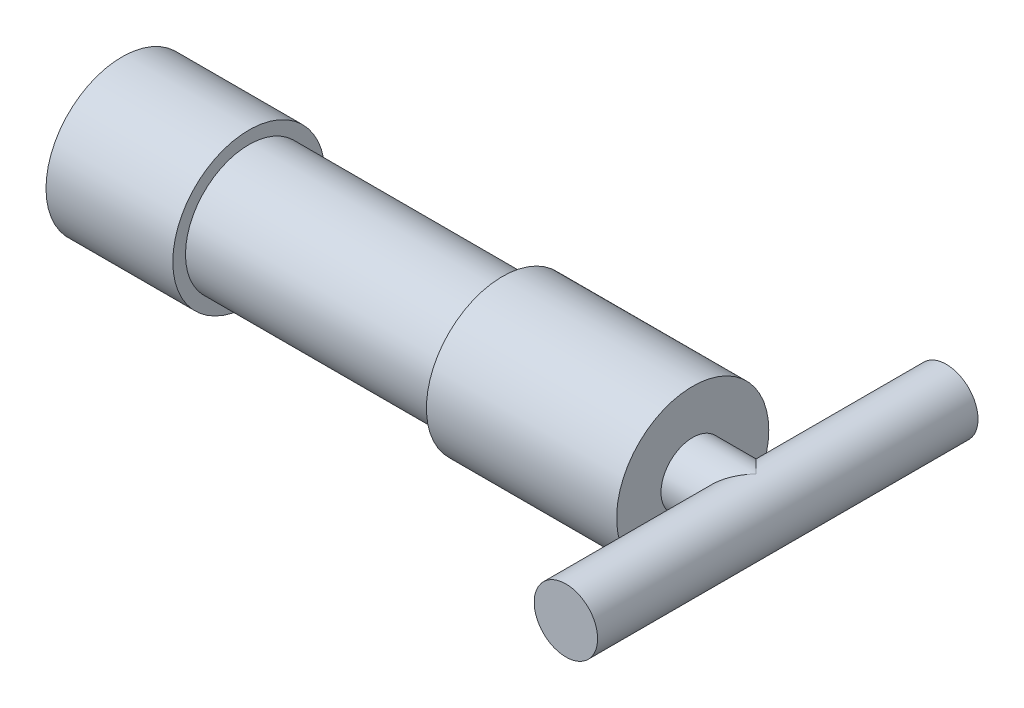
ISO-10303-21;
HEADER;
FILE_DESCRIPTION(('STEP AP214'),'2;1');
FILE_NAME('part.step','',(''),(''),'','','');
FILE_SCHEMA(('AUTOMOTIVE_DESIGN { 1 0 10303 214 1 1 1 1 }'));
ENDSEC;
DATA;
#1=APPLICATION_CONTEXT('core data for automotive mechanical design processes');
#2=APPLICATION_PROTOCOL_DEFINITION('international standard','automotive_design',2000,#1);
#3=PRODUCT_CONTEXT('',#1,'mechanical');
#4=PRODUCT('Part','Part','',(#3));
#5=PRODUCT_RELATED_PRODUCT_CATEGORY('part','',(#4));
#6=PRODUCT_DEFINITION_FORMATION('','',#4);
#7=PRODUCT_DEFINITION_CONTEXT('part definition',#1,'design');
#8=PRODUCT_DEFINITION('design','',#6,#7);
#9=PRODUCT_DEFINITION_SHAPE('','',#8);
#10=(LENGTH_UNIT() NAMED_UNIT(*) SI_UNIT(.MILLI.,.METRE.));
#11=(NAMED_UNIT(*) PLANE_ANGLE_UNIT() SI_UNIT($,.RADIAN.));
#12=(NAMED_UNIT(*) SI_UNIT($,.STERADIAN.) SOLID_ANGLE_UNIT());
#13=UNCERTAINTY_MEASURE_WITH_UNIT(LENGTH_MEASURE(1.E-05),#10,'distance_accuracy_value','');
#14=(GEOMETRIC_REPRESENTATION_CONTEXT(3) GLOBAL_UNCERTAINTY_ASSIGNED_CONTEXT((#13)) GLOBAL_UNIT_ASSIGNED_CONTEXT((#10,
#11,#12)) REPRESENTATION_CONTEXT('',''));
#15=CARTESIAN_POINT('',(0.,0.,0.));
#16=DIRECTION('',(0.,0.,1.));
#17=DIRECTION('',(1.,0.,0.));
#18=AXIS2_PLACEMENT_3D('',#15,#16,#17);
#19=CARTESIAN_POINT('',(35.,0.,0.));
#20=DIRECTION('',(1.,0.,0.));
#21=DIRECTION('',(0.,0.,-1.));
#22=AXIS2_PLACEMENT_3D('',#19,#20,#21);
#23=PLANE('',#22);
#24=CARTESIAN_POINT('',(35.,0.,0.));
#25=DIRECTION('',(1.,0.,0.));
#26=DIRECTION('',(0.,0.,-1.));
#27=AXIS2_PLACEMENT_3D('',#24,#25,#26);
#28=CIRCLE('',#27,2.5);
#29=CARTESIAN_POINT('',(35.,0.,-2.5));
#30=VERTEX_POINT('',#29);
#31=EDGE_CURVE('E43',#30,#30,#28,.T.);
#32=ORIENTED_EDGE('',*,*,#31,.F.);
#33=EDGE_LOOP('',(#32));
#34=FACE_BOUND('',#33,.T.);
#35=CARTESIAN_POINT('',(35.,0.,0.));
#36=DIRECTION('',(1.,0.,0.));
#37=DIRECTION('',(0.,0.,-1.));
#38=AXIS2_PLACEMENT_3D('',#35,#36,#37);
#39=CIRCLE('',#38,6.);
#40=CARTESIAN_POINT('',(35.,0.,-6.));
#41=VERTEX_POINT('',#40);
#42=EDGE_CURVE('E58',#41,#41,#39,.T.);
#43=ORIENTED_EDGE('',*,*,#42,.T.);
#44=EDGE_LOOP('',(#43));
#45=FACE_BOUND('',#44,.T.);
#46=ADVANCED_FACE('F35',(#34,#45),#23,.T.);
#47=CARTESIAN_POINT('',(40.,0.,0.));
#48=DIRECTION('',(-1.,0.,0.));
#49=DIRECTION('',(0.,0.,1.));
#50=AXIS2_PLACEMENT_3D('',#47,#48,#49);
#51=CYLINDRICAL_SURFACE('',#50,2.5);
#52=CARTESIAN_POINT('',(40.,0.,0.));
#53=DIRECTION('',(-0.707106781186547,0.,-0.707106781186547));
#54=DIRECTION('',(-0.707106781186547,0.,0.707106781186547));
#55=AXIS2_PLACEMENT_3D('',#52,#53,#54);
#56=ELLIPSE('',#55,3.53553390593273,2.5);
#57=CARTESIAN_POINT('',(40.,-2.49999999999999,0.));
#58=VERTEX_POINT('',#57);
#59=CARTESIAN_POINT('',(40.,2.5,0.));
#60=VERTEX_POINT('',#59);
#61=EDGE_CURVE('E51',#58,#60,#56,.T.);
#62=ORIENTED_EDGE('',*,*,#61,.T.);
#63=CARTESIAN_POINT('',(40.,0.,0.));
#64=DIRECTION('',(-0.707106781186547,0.,0.707106781186547));
#65=DIRECTION('',(-0.707106781186547,0.,-0.707106781186547));
#66=AXIS2_PLACEMENT_3D('',#63,#64,#65);
#67=ELLIPSE('',#66,3.53553390593273,2.5);
#68=EDGE_CURVE('E49',#60,#58,#67,.T.);
#69=ORIENTED_EDGE('',*,*,#68,.T.);
#70=EDGE_LOOP('',(#62,#69));
#71=FACE_BOUND('',#70,.T.);
#72=ORIENTED_EDGE('',*,*,#31,.T.);
#73=EDGE_LOOP('',(#72));
#74=FACE_BOUND('',#73,.T.);
#75=ADVANCED_FACE('F56',(#71,#74),#51,.T.);
#76=CARTESIAN_POINT('',(20.,0.,0.));
#77=DIRECTION('',(1.,0.,0.));
#78=DIRECTION('',(0.,0.,-1.));
#79=AXIS2_PLACEMENT_3D('',#76,#77,#78);
#80=PLANE('',#79);
#81=CARTESIAN_POINT('',(20.,0.,0.));
#82=DIRECTION('',(1.,0.,0.));
#83=DIRECTION('',(0.,0.,-1.));
#84=AXIS2_PLACEMENT_3D('',#81,#82,#83);
#85=CIRCLE('',#84,6.);
#86=CARTESIAN_POINT('',(20.,0.,-6.));
#87=VERTEX_POINT('',#86);
#88=EDGE_CURVE('E61',#87,#87,#85,.T.);
#89=ORIENTED_EDGE('',*,*,#88,.F.);
#90=EDGE_LOOP('',(#89));
#91=FACE_BOUND('',#90,.T.);
#92=CARTESIAN_POINT('',(20.,0.,0.));
#93=DIRECTION('',(1.,0.,0.));
#94=DIRECTION('',(0.,0.,-1.));
#95=AXIS2_PLACEMENT_3D('',#92,#93,#94);
#96=CIRCLE('',#95,5.);
#97=CARTESIAN_POINT('',(20.,0.,-5.));
#98=VERTEX_POINT('',#97);
#99=EDGE_CURVE('E11',#98,#98,#96,.T.);
#100=ORIENTED_EDGE('',*,*,#99,.T.);
#101=EDGE_LOOP('',(#100));
#102=FACE_BOUND('',#101,.T.);
#103=ADVANCED_FACE('F75',(#91,#102),#80,.F.);
#104=CARTESIAN_POINT('',(20.,0.,0.));
#105=DIRECTION('',(1.,0.,0.));
#106=DIRECTION('',(0.,0.,-1.));
#107=AXIS2_PLACEMENT_3D('',#104,#105,#106);
#108=CYLINDRICAL_SURFACE('',#107,6.);
#109=ORIENTED_EDGE('',*,*,#88,.T.);
#110=EDGE_LOOP('',(#109));
#111=FACE_BOUND('',#110,.T.);
#112=ORIENTED_EDGE('',*,*,#42,.F.);
#113=EDGE_LOOP('',(#112));
#114=FACE_BOUND('',#113,.T.);
#115=ADVANCED_FACE('F73',(#111,#114),#108,.T.);
#116=CARTESIAN_POINT('',(35.,0.,0.));
#117=DIRECTION('',(-1.,0.,0.));
#118=DIRECTION('',(0.,0.,1.));
#119=AXIS2_PLACEMENT_3D('',#116,#117,#118);
#120=CYLINDRICAL_SURFACE('',#119,5.);
#121=CARTESIAN_POINT('',(0.,0.,0.));
#122=DIRECTION('',(-1.,0.,0.));
#123=DIRECTION('',(0.,0.,1.));
#124=AXIS2_PLACEMENT_3D('',#121,#122,#123);
#125=CIRCLE('',#124,5.);
#126=CARTESIAN_POINT('',(0.,0.,5.));
#127=VERTEX_POINT('',#126);
#128=EDGE_CURVE('E173',#127,#127,#125,.T.);
#129=ORIENTED_EDGE('',*,*,#128,.F.);
#130=EDGE_LOOP('',(#129));
#131=FACE_BOUND('',#130,.T.);
#132=ORIENTED_EDGE('',*,*,#99,.F.);
#133=EDGE_LOOP('',(#132));
#134=FACE_BOUND('',#133,.T.);
#135=ADVANCED_FACE('F37',(#131,#134),#120,.T.);
#136=CARTESIAN_POINT('',(40.,0.,-15.));
#137=DIRECTION('',(0.,0.,1.));
#138=DIRECTION('',(1.,0.,0.));
#139=AXIS2_PLACEMENT_3D('',#136,#137,#138);
#140=CYLINDRICAL_SURFACE('',#139,2.49999999999999);
#141=CARTESIAN_POINT('',(40.,0.,15.));
#142=DIRECTION('',(0.,0.,1.));
#143=DIRECTION('',(1.,0.,0.));
#144=AXIS2_PLACEMENT_3D('',#141,#142,#143);
#145=CIRCLE('',#144,2.49999999999999);
#146=CARTESIAN_POINT('',(42.5,0.,15.));
#147=VERTEX_POINT('',#146);
#148=EDGE_CURVE('E177',#147,#147,#145,.T.);
#149=ORIENTED_EDGE('',*,*,#148,.F.);
#150=EDGE_LOOP('',(#149));
#151=FACE_BOUND('',#150,.T.);
#152=CARTESIAN_POINT('',(40.,0.,-15.));
#153=DIRECTION('',(0.,0.,1.));
#154=DIRECTION('',(1.,0.,0.));
#155=AXIS2_PLACEMENT_3D('',#152,#153,#154);
#156=CIRCLE('',#155,2.49999999999999);
#157=CARTESIAN_POINT('',(42.5,0.,-15.));
#158=VERTEX_POINT('',#157);
#159=EDGE_CURVE('E54',#158,#158,#156,.T.);
#160=ORIENTED_EDGE('',*,*,#159,.T.);
#161=EDGE_LOOP('',(#160));
#162=FACE_BOUND('',#161,.T.);
#163=ORIENTED_EDGE('',*,*,#68,.F.);
#164=ORIENTED_EDGE('',*,*,#61,.F.);
#165=EDGE_LOOP('',(#163,#164));
#166=FACE_BOUND('',#165,.T.);
#167=ADVANCED_FACE('F52',(#151,#162,#166),#140,.T.);
#168=CARTESIAN_POINT('',(40.,0.,-15.));
#169=DIRECTION('',(0.,0.,1.));
#170=DIRECTION('',(1.,0.,0.));
#171=AXIS2_PLACEMENT_3D('',#168,#169,#170);
#172=PLANE('',#171);
#173=ORIENTED_EDGE('',*,*,#159,.F.);
#174=EDGE_LOOP('',(#173));
#175=FACE_BOUND('',#174,.T.);
#176=ADVANCED_FACE('F117',(#175),#172,.F.);
#177=CARTESIAN_POINT('',(40.,0.,15.));
#178=DIRECTION('',(0.,0.,1.));
#179=DIRECTION('',(1.,0.,0.));
#180=AXIS2_PLACEMENT_3D('',#177,#178,#179);
#181=PLANE('',#180);
#182=ORIENTED_EDGE('',*,*,#148,.T.);
#183=EDGE_LOOP('',(#182));
#184=FACE_BOUND('',#183,.T.);
#185=ADVANCED_FACE('F123',(#184),#181,.T.);
#186=CARTESIAN_POINT('',(0.,0.,0.));
#187=DIRECTION('',(-1.,0.,0.));
#188=DIRECTION('',(0.,0.,1.));
#189=AXIS2_PLACEMENT_3D('',#186,#187,#188);
#190=PLANE('',#189);
#191=CARTESIAN_POINT('',(0.,0.,0.));
#192=DIRECTION('',(-1.,0.,0.));
#193=DIRECTION('',(0.,0.,1.));
#194=AXIS2_PLACEMENT_3D('',#191,#192,#193);
#195=CIRCLE('',#194,6.);
#196=CARTESIAN_POINT('',(0.,0.,6.));
#197=VERTEX_POINT('',#196);
#198=EDGE_CURVE('E174',#197,#197,#195,.T.);
#199=ORIENTED_EDGE('',*,*,#198,.F.);
#200=EDGE_LOOP('',(#199));
#201=FACE_BOUND('',#200,.T.);
#202=ORIENTED_EDGE('',*,*,#128,.T.);
#203=EDGE_LOOP('',(#202));
#204=FACE_BOUND('',#203,.T.);
#205=ADVANCED_FACE('F131',(#201,#204),#190,.F.);
#206=CARTESIAN_POINT('',(-10.,0.,0.));
#207=DIRECTION('',(1.,0.,0.));
#208=DIRECTION('',(0.,0.,-1.));
#209=AXIS2_PLACEMENT_3D('',#206,#207,#208);
#210=CYLINDRICAL_SURFACE('',#209,6.);
#211=CARTESIAN_POINT('',(-10.,0.,0.));
#212=DIRECTION('',(-1.,0.,0.));
#213=DIRECTION('',(0.,0.,1.));
#214=AXIS2_PLACEMENT_3D('',#211,#212,#213);
#215=CIRCLE('',#214,6.);
#216=CARTESIAN_POINT('',(-10.,0.,6.));
#217=VERTEX_POINT('',#216);
#218=EDGE_CURVE('E172',#217,#217,#215,.T.);
#219=ORIENTED_EDGE('',*,*,#218,.F.);
#220=EDGE_LOOP('',(#219));
#221=FACE_BOUND('',#220,.T.);
#222=ORIENTED_EDGE('',*,*,#198,.T.);
#223=EDGE_LOOP('',(#222));
#224=FACE_BOUND('',#223,.T.);
#225=ADVANCED_FACE('F139',(#221,#224),#210,.T.);
#226=CARTESIAN_POINT('',(-10.,0.,0.));
#227=DIRECTION('',(-1.,0.,0.));
#228=DIRECTION('',(0.,0.,1.));
#229=AXIS2_PLACEMENT_3D('',#226,#227,#228);
#230=PLANE('',#229);
#231=ORIENTED_EDGE('',*,*,#218,.T.);
#232=EDGE_LOOP('',(#231));
#233=FACE_BOUND('',#232,.T.);
#234=ADVANCED_FACE('F147',(#233),#230,.T.);
#235=CLOSED_SHELL('',(#46,#75,#103,#115,#135,#167,#176,#185,#205,#225,#234));
#236=MANIFOLD_SOLID_BREP('B2',#235);
#237=ADVANCED_BREP_SHAPE_REPRESENTATION('',(#18,#236),#14);
#238=SHAPE_DEFINITION_REPRESENTATION(#9,#237);
ENDSEC;
END-ISO-10303-21;
